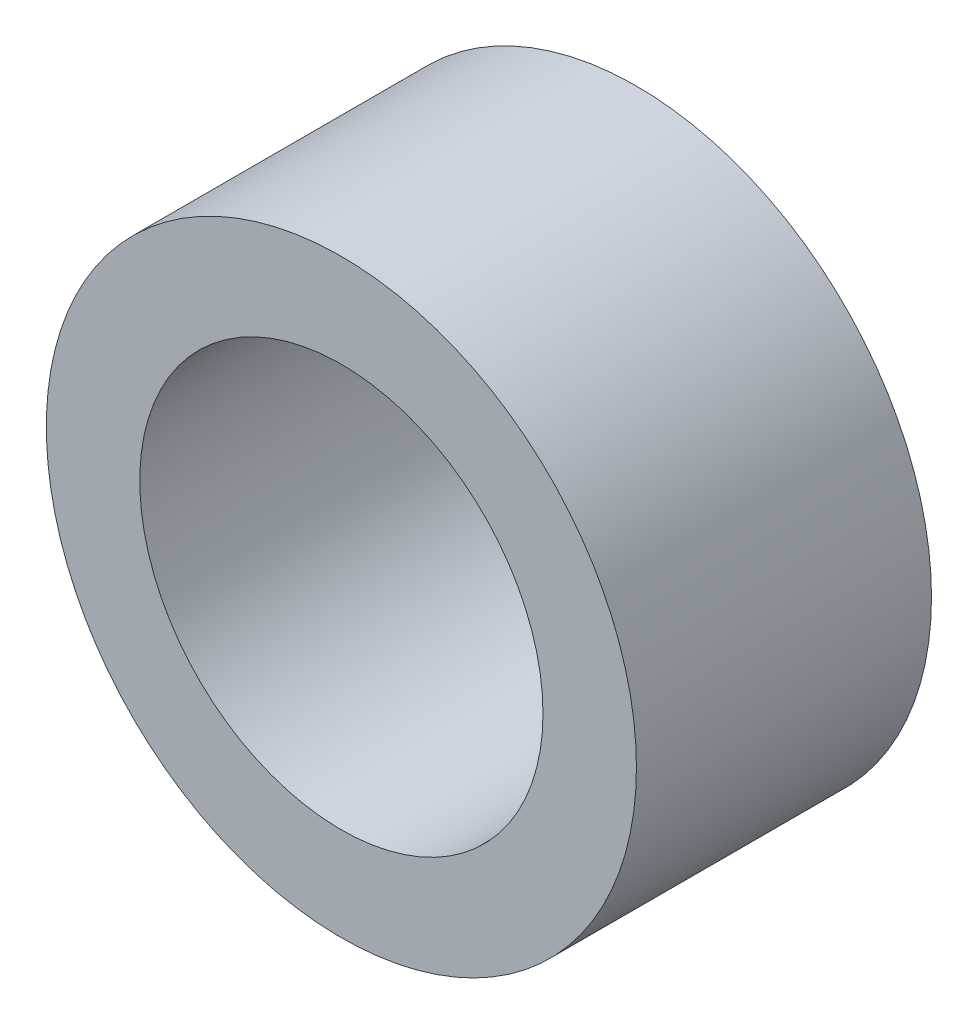
ISO-10303-21;
HEADER;
FILE_DESCRIPTION(('STEP AP214'),'2;1');
FILE_NAME('part.step','',(''),(''),'','','');
FILE_SCHEMA(('AUTOMOTIVE_DESIGN { 1 0 10303 214 1 1 1 1 }'));
ENDSEC;
DATA;
#1=APPLICATION_CONTEXT('core data for automotive mechanical design processes');
#2=APPLICATION_PROTOCOL_DEFINITION('international standard','automotive_design',2000,#1);
#3=PRODUCT_CONTEXT('',#1,'mechanical');
#4=PRODUCT('Part','Part','',(#3));
#5=PRODUCT_RELATED_PRODUCT_CATEGORY('part','',(#4));
#6=PRODUCT_DEFINITION_FORMATION('','',#4);
#7=PRODUCT_DEFINITION_CONTEXT('part definition',#1,'design');
#8=PRODUCT_DEFINITION('design','',#6,#7);
#9=PRODUCT_DEFINITION_SHAPE('','',#8);
#10=(LENGTH_UNIT() NAMED_UNIT(*) SI_UNIT(.MILLI.,.METRE.));
#11=(NAMED_UNIT(*) PLANE_ANGLE_UNIT() SI_UNIT($,.RADIAN.));
#12=(NAMED_UNIT(*) SI_UNIT($,.STERADIAN.) SOLID_ANGLE_UNIT());
#13=UNCERTAINTY_MEASURE_WITH_UNIT(LENGTH_MEASURE(1.E-05),#10,'distance_accuracy_value','');
#14=(GEOMETRIC_REPRESENTATION_CONTEXT(3) GLOBAL_UNCERTAINTY_ASSIGNED_CONTEXT((#13)) GLOBAL_UNIT_ASSIGNED_CONTEXT((#10,
#11,#12)) REPRESENTATION_CONTEXT('',''));
#15=CARTESIAN_POINT('',(0.,0.,0.));
#16=DIRECTION('',(0.,0.,1.));
#17=DIRECTION('',(1.,0.,0.));
#18=AXIS2_PLACEMENT_3D('',#15,#16,#17);
#19=CARTESIAN_POINT('',(-6.,0.,3.));
#20=DIRECTION('',(0.,0.,-1.));
#21=DIRECTION('',(-1.,0.,0.));
#22=AXIS2_PLACEMENT_3D('',#19,#20,#21);
#23=PLANE('',#22);
#24=CARTESIAN_POINT('',(0.,0.,3.));
#25=DIRECTION('',(0.,0.,1.));
#26=DIRECTION('',(1.,0.,0.));
#27=AXIS2_PLACEMENT_3D('',#24,#25,#26);
#28=CIRCLE('',#27,4.1);
#29=CARTESIAN_POINT('',(4.1,0.,3.));
#30=VERTEX_POINT('',#29);
#31=EDGE_CURVE('E58',#30,#30,#28,.T.);
#32=ORIENTED_EDGE('',*,*,#31,.F.);
#33=EDGE_LOOP('',(#32));
#34=FACE_BOUND('',#33,.T.);
#35=CARTESIAN_POINT('',(0.,0.,3.));
#36=DIRECTION('',(0.,0.,1.));
#37=DIRECTION('',(1.,0.,0.));
#38=AXIS2_PLACEMENT_3D('',#35,#36,#37);
#39=CIRCLE('',#38,6.);
#40=CARTESIAN_POINT('',(6.,0.,3.));
#41=VERTEX_POINT('',#40);
#42=EDGE_CURVE('E48',#41,#41,#39,.T.);
#43=ORIENTED_EDGE('',*,*,#42,.T.);
#44=EDGE_LOOP('',(#43));
#45=FACE_BOUND('',#44,.T.);
#46=ADVANCED_FACE('F41',(#34,#45),#23,.F.);
#47=CARTESIAN_POINT('',(-6.,0.,-3.));
#48=DIRECTION('',(0.,0.,1.));
#49=DIRECTION('',(1.,0.,0.));
#50=AXIS2_PLACEMENT_3D('',#47,#48,#49);
#51=PLANE('',#50);
#52=CARTESIAN_POINT('',(0.,0.,-3.));
#53=DIRECTION('',(0.,0.,1.));
#54=DIRECTION('',(1.,0.,0.));
#55=AXIS2_PLACEMENT_3D('',#52,#53,#54);
#56=CIRCLE('',#55,4.1);
#57=CARTESIAN_POINT('',(4.1,0.,-3.));
#58=VERTEX_POINT('',#57);
#59=EDGE_CURVE('E53',#58,#58,#56,.T.);
#60=ORIENTED_EDGE('',*,*,#59,.T.);
#61=EDGE_LOOP('',(#60));
#62=FACE_BOUND('',#61,.T.);
#63=CARTESIAN_POINT('',(0.,0.,-3.));
#64=DIRECTION('',(0.,0.,1.));
#65=DIRECTION('',(1.,0.,0.));
#66=AXIS2_PLACEMENT_3D('',#63,#64,#65);
#67=CIRCLE('',#66,6.);
#68=CARTESIAN_POINT('',(6.,0.,-3.));
#69=VERTEX_POINT('',#68);
#70=EDGE_CURVE('E10',#69,#69,#67,.T.);
#71=ORIENTED_EDGE('',*,*,#70,.F.);
#72=EDGE_LOOP('',(#71));
#73=FACE_BOUND('',#72,.T.);
#74=ADVANCED_FACE('F68',(#62,#73),#51,.F.);
#75=CARTESIAN_POINT('',(0.,0.,3.));
#76=DIRECTION('',(0.,0.,1.));
#77=DIRECTION('',(1.,0.,0.));
#78=AXIS2_PLACEMENT_3D('',#75,#76,#77);
#79=CYLINDRICAL_SURFACE('',#78,6.);
#80=ORIENTED_EDGE('',*,*,#42,.F.);
#81=EDGE_LOOP('',(#80));
#82=FACE_BOUND('',#81,.T.);
#83=ORIENTED_EDGE('',*,*,#70,.T.);
#84=EDGE_LOOP('',(#83));
#85=FACE_BOUND('',#84,.T.);
#86=ADVANCED_FACE('F73',(#82,#85),#79,.T.);
#87=CARTESIAN_POINT('',(0.,0.,-3.));
#88=DIRECTION('',(0.,0.,1.));
#89=DIRECTION('',(1.,0.,0.));
#90=AXIS2_PLACEMENT_3D('',#87,#88,#89);
#91=CYLINDRICAL_SURFACE('',#90,4.1);
#92=ORIENTED_EDGE('',*,*,#59,.F.);
#93=EDGE_LOOP('',(#92));
#94=FACE_BOUND('',#93,.T.);
#95=ORIENTED_EDGE('',*,*,#31,.T.);
#96=EDGE_LOOP('',(#95));
#97=FACE_BOUND('',#96,.T.);
#98=ADVANCED_FACE('F65',(#94,#97),#91,.F.);
#99=CLOSED_SHELL('',(#46,#74,#86,#98));
#100=MANIFOLD_SOLID_BREP('B2',#99);
#101=ADVANCED_BREP_SHAPE_REPRESENTATION('',(#18,#100),#14);
#102=SHAPE_DEFINITION_REPRESENTATION(#9,#101);
ENDSEC;
END-ISO-10303-21;
